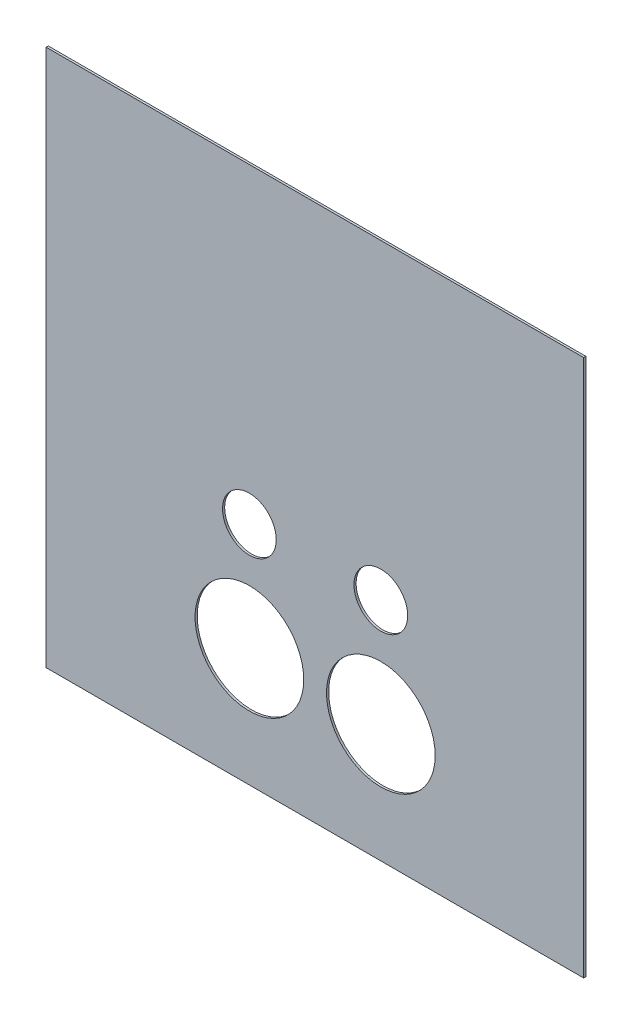
ISO-10303-21;
HEADER;
FILE_DESCRIPTION(('STEP AP214'),'2;1');
FILE_NAME('part.step','',(''),(''),'','','');
FILE_SCHEMA(('AUTOMOTIVE_DESIGN { 1 0 10303 214 1 1 1 1 }'));
ENDSEC;
DATA;
#1=APPLICATION_CONTEXT('core data for automotive mechanical design processes');
#2=APPLICATION_PROTOCOL_DEFINITION('international standard','automotive_design',2000,#1);
#3=PRODUCT_CONTEXT('',#1,'mechanical');
#4=PRODUCT('Part','Part','',(#3));
#5=PRODUCT_RELATED_PRODUCT_CATEGORY('part','',(#4));
#6=PRODUCT_DEFINITION_FORMATION('','',#4);
#7=PRODUCT_DEFINITION_CONTEXT('part definition',#1,'design');
#8=PRODUCT_DEFINITION('design','',#6,#7);
#9=PRODUCT_DEFINITION_SHAPE('','',#8);
#10=(LENGTH_UNIT() NAMED_UNIT(*) SI_UNIT(.MILLI.,.METRE.));
#11=(NAMED_UNIT(*) PLANE_ANGLE_UNIT() SI_UNIT($,.RADIAN.));
#12=(NAMED_UNIT(*) SI_UNIT($,.STERADIAN.) SOLID_ANGLE_UNIT());
#13=UNCERTAINTY_MEASURE_WITH_UNIT(LENGTH_MEASURE(1.E-05),#10,'distance_accuracy_value','');
#14=(GEOMETRIC_REPRESENTATION_CONTEXT(3) GLOBAL_UNCERTAINTY_ASSIGNED_CONTEXT((#13)) GLOBAL_UNIT_ASSIGNED_CONTEXT((#10,
#11,#12)) REPRESENTATION_CONTEXT('',''));
#15=CARTESIAN_POINT('',(0.,0.,0.));
#16=DIRECTION('',(0.,0.,1.));
#17=DIRECTION('',(1.,0.,0.));
#18=AXIS2_PLACEMENT_3D('',#15,#16,#17);
#19=CARTESIAN_POINT('',(-130.1775147929,329.881656804734,2.));
#20=DIRECTION('',(0.,1.,0.));
#21=DIRECTION('',(0.,0.,1.));
#22=AXIS2_PLACEMENT_3D('',#19,#20,#21);
#23=PLANE('',#22);
#24=DIRECTION('',(1.,0.,0.));
#25=VECTOR('',#24,1.);
#26=CARTESIAN_POINT('',(-130.1775147929,329.881656804734,0.));
#27=LINE('',#26,#25);
#28=CARTESIAN_POINT('',(-130.1775147929,329.881656804734,0.));
#29=VERTEX_POINT('',#28);
#30=CARTESIAN_POINT('',(369.8224852071,329.881656804734,0.));
#31=VERTEX_POINT('',#30);
#32=EDGE_CURVE('E101',#29,#31,#27,.T.);
#33=ORIENTED_EDGE('',*,*,#32,.F.);
#34=DIRECTION('',(0.,0.,-1.));
#35=VECTOR('',#34,1.);
#36=CARTESIAN_POINT('',(-130.1775147929,329.881656804734,2.));
#37=LINE('',#36,#35);
#38=CARTESIAN_POINT('',(-130.1775147929,329.881656804734,2.));
#39=VERTEX_POINT('',#38);
#40=EDGE_CURVE('E11',#39,#29,#37,.T.);
#41=ORIENTED_EDGE('',*,*,#40,.F.);
#42=DIRECTION('',(1.,0.,0.));
#43=VECTOR('',#42,1.);
#44=CARTESIAN_POINT('',(-130.1775147929,329.881656804734,2.));
#45=LINE('',#44,#43);
#46=CARTESIAN_POINT('',(369.8224852071,329.881656804734,2.));
#47=VERTEX_POINT('',#46);
#48=EDGE_CURVE('E95',#39,#47,#45,.T.);
#49=ORIENTED_EDGE('',*,*,#48,.T.);
#50=DIRECTION('',(0.,0.,-1.));
#51=VECTOR('',#50,1.);
#52=CARTESIAN_POINT('',(369.8224852071,329.881656804734,2.));
#53=LINE('',#52,#51);
#54=EDGE_CURVE('E74',#47,#31,#53,.T.);
#55=ORIENTED_EDGE('',*,*,#54,.T.);
#56=EDGE_LOOP('',(#33,#41,#49,#55));
#57=FACE_BOUND('',#56,.T.);
#58=ADVANCED_FACE('F33',(#57),#23,.T.);
#59=CARTESIAN_POINT('',(-130.1775147929,329.881656804734,2.));
#60=DIRECTION('',(1.,0.,0.));
#61=DIRECTION('',(0.,1.,0.));
#62=AXIS2_PLACEMENT_3D('',#59,#60,#61);
#63=PLANE('',#62);
#64=DIRECTION('',(0.,-1.,0.));
#65=VECTOR('',#64,1.);
#66=CARTESIAN_POINT('',(-130.1775147929,329.881656804734,0.));
#67=LINE('',#66,#65);
#68=CARTESIAN_POINT('',(-130.1775147929,-170.118343195266,0.));
#69=VERTEX_POINT('',#68);
#70=EDGE_CURVE('E66',#29,#69,#67,.T.);
#71=ORIENTED_EDGE('',*,*,#70,.T.);
#72=DIRECTION('',(0.,0.,-1.));
#73=VECTOR('',#72,1.);
#74=CARTESIAN_POINT('',(-130.1775147929,-170.118343195266,2.));
#75=LINE('',#74,#73);
#76=CARTESIAN_POINT('',(-130.1775147929,-170.118343195266,2.));
#77=VERTEX_POINT('',#76);
#78=EDGE_CURVE('E42',#77,#69,#75,.T.);
#79=ORIENTED_EDGE('',*,*,#78,.F.);
#80=DIRECTION('',(0.,-1.,0.));
#81=VECTOR('',#80,1.);
#82=CARTESIAN_POINT('',(-130.1775147929,329.881656804734,2.));
#83=LINE('',#82,#81);
#84=EDGE_CURVE('E84',#39,#77,#83,.T.);
#85=ORIENTED_EDGE('',*,*,#84,.F.);
#86=ORIENTED_EDGE('',*,*,#40,.T.);
#87=EDGE_LOOP('',(#71,#79,#85,#86));
#88=FACE_BOUND('',#87,.T.);
#89=ADVANCED_FACE('F151',(#88),#63,.F.);
#90=CARTESIAN_POINT('',(-130.1775147929,-170.118343195266,2.));
#91=DIRECTION('',(0.,1.,0.));
#92=DIRECTION('',(-1.,0.,0.));
#93=AXIS2_PLACEMENT_3D('',#90,#91,#92);
#94=PLANE('',#93);
#95=DIRECTION('',(1.,0.,0.));
#96=VECTOR('',#95,1.);
#97=CARTESIAN_POINT('',(-130.1775147929,-170.118343195266,0.));
#98=LINE('',#97,#96);
#99=CARTESIAN_POINT('',(369.8224852071,-170.118343195266,0.));
#100=VERTEX_POINT('',#99);
#101=EDGE_CURVE('E91',#69,#100,#98,.T.);
#102=ORIENTED_EDGE('',*,*,#101,.T.);
#103=DIRECTION('',(0.,0.,-1.));
#104=VECTOR('',#103,1.);
#105=CARTESIAN_POINT('',(369.8224852071,-170.118343195266,2.));
#106=LINE('',#105,#104);
#107=CARTESIAN_POINT('',(369.8224852071,-170.118343195266,2.));
#108=VERTEX_POINT('',#107);
#109=EDGE_CURVE('E88',#108,#100,#106,.T.);
#110=ORIENTED_EDGE('',*,*,#109,.F.);
#111=DIRECTION('',(1.,0.,0.));
#112=VECTOR('',#111,1.);
#113=CARTESIAN_POINT('',(-130.1775147929,-170.118343195266,2.));
#114=LINE('',#113,#112);
#115=EDGE_CURVE('E79',#77,#108,#114,.T.);
#116=ORIENTED_EDGE('',*,*,#115,.F.);
#117=ORIENTED_EDGE('',*,*,#78,.T.);
#118=EDGE_LOOP('',(#102,#110,#116,#117));
#119=FACE_BOUND('',#118,.T.);
#120=ADVANCED_FACE('F89',(#119),#94,.F.);
#121=CARTESIAN_POINT('',(369.8224852071,329.881656804734,2.));
#122=DIRECTION('',(1.,0.,0.));
#123=DIRECTION('',(0.,0.,-1.));
#124=AXIS2_PLACEMENT_3D('',#121,#122,#123);
#125=PLANE('',#124);
#126=DIRECTION('',(0.,-1.,0.));
#127=VECTOR('',#126,1.);
#128=CARTESIAN_POINT('',(369.8224852071,329.881656804734,0.));
#129=LINE('',#128,#127);
#130=EDGE_CURVE('E104',#31,#100,#129,.T.);
#131=ORIENTED_EDGE('',*,*,#130,.F.);
#132=ORIENTED_EDGE('',*,*,#54,.F.);
#133=DIRECTION('',(0.,-1.,0.));
#134=VECTOR('',#133,1.);
#135=CARTESIAN_POINT('',(369.8224852071,329.881656804734,2.));
#136=LINE('',#135,#134);
#137=EDGE_CURVE('E83',#47,#108,#136,.T.);
#138=ORIENTED_EDGE('',*,*,#137,.T.);
#139=ORIENTED_EDGE('',*,*,#109,.T.);
#140=EDGE_LOOP('',(#131,#132,#138,#139));
#141=FACE_BOUND('',#140,.T.);
#142=ADVANCED_FACE('F94',(#141),#125,.T.);
#143=CARTESIAN_POINT('',(0.,0.,2.));
#144=DIRECTION('',(0.,0.,-1.));
#145=DIRECTION('',(-1.,0.,0.));
#146=AXIS2_PLACEMENT_3D('',#143,#144,#145);
#147=PLANE('',#146);
#148=CARTESIAN_POINT('',(181.1424852071,40.0316568047339,2.));
#149=DIRECTION('',(0.,0.,1.));
#150=DIRECTION('',(1.,0.,0.));
#151=AXIS2_PLACEMENT_3D('',#148,#149,#150);
#152=CIRCLE('',#151,25.);
#153=CARTESIAN_POINT('',(206.1424852071,40.0316568047339,2.));
#154=VERTEX_POINT('',#153);
#155=EDGE_CURVE('E112',#154,#154,#152,.T.);
#156=ORIENTED_EDGE('',*,*,#155,.F.);
#157=EDGE_LOOP('',(#156));
#158=FACE_BOUND('',#157,.T.);
#159=CARTESIAN_POINT('',(58.8424852071004,40.0316568047339,2.));
#160=DIRECTION('',(0.,0.,1.));
#161=DIRECTION('',(1.,0.,0.));
#162=AXIS2_PLACEMENT_3D('',#159,#160,#161);
#163=CIRCLE('',#162,25.);
#164=CARTESIAN_POINT('',(83.8424852071004,40.0316568047339,2.));
#165=VERTEX_POINT('',#164);
#166=EDGE_CURVE('E118',#165,#165,#163,.T.);
#167=ORIENTED_EDGE('',*,*,#166,.F.);
#168=EDGE_LOOP('',(#167));
#169=FACE_BOUND('',#168,.T.);
#170=CARTESIAN_POINT('',(58.8424852071004,-59.9683431952661,2.));
#171=DIRECTION('',(0.,0.,1.));
#172=DIRECTION('',(1.,0.,0.));
#173=AXIS2_PLACEMENT_3D('',#170,#171,#172);
#174=CIRCLE('',#173,50.55);
#175=CARTESIAN_POINT('',(109.3924852071,-59.9683431952661,2.));
#176=VERTEX_POINT('',#175);
#177=EDGE_CURVE('E127',#176,#176,#174,.T.);
#178=ORIENTED_EDGE('',*,*,#177,.F.);
#179=EDGE_LOOP('',(#178));
#180=FACE_BOUND('',#179,.T.);
#181=CARTESIAN_POINT('',(181.1424852071,-59.9683431952661,2.));
#182=DIRECTION('',(0.,0.,1.));
#183=DIRECTION('',(1.,0.,0.));
#184=AXIS2_PLACEMENT_3D('',#181,#182,#183);
#185=CIRCLE('',#184,50.55);
#186=CARTESIAN_POINT('',(231.6924852071,-59.9683431952661,2.));
#187=VERTEX_POINT('',#186);
#188=EDGE_CURVE('E116',#187,#187,#185,.T.);
#189=ORIENTED_EDGE('',*,*,#188,.F.);
#190=EDGE_LOOP('',(#189));
#191=FACE_BOUND('',#190,.T.);
#192=ORIENTED_EDGE('',*,*,#48,.F.);
#193=ORIENTED_EDGE('',*,*,#84,.T.);
#194=ORIENTED_EDGE('',*,*,#115,.T.);
#195=ORIENTED_EDGE('',*,*,#137,.F.);
#196=EDGE_LOOP('',(#192,#193,#194,#195));
#197=FACE_BOUND('',#196,.T.);
#198=ADVANCED_FACE('F82',(#158,#169,#180,#191,#197),#147,.F.);
#199=CARTESIAN_POINT('',(0.,0.,0.));
#200=DIRECTION('',(0.,0.,-1.));
#201=DIRECTION('',(-1.,0.,0.));
#202=AXIS2_PLACEMENT_3D('',#199,#200,#201);
#203=PLANE('',#202);
#204=CARTESIAN_POINT('',(181.1424852071,40.0316568047339,0.));
#205=DIRECTION('',(0.,0.,-1.));
#206=DIRECTION('',(-1.,0.,0.));
#207=AXIS2_PLACEMENT_3D('',#204,#205,#206);
#208=CIRCLE('',#207,25.);
#209=CARTESIAN_POINT('',(156.1424852071,40.0316568047339,0.));
#210=VERTEX_POINT('',#209);
#211=EDGE_CURVE('E36',#210,#210,#208,.T.);
#212=ORIENTED_EDGE('',*,*,#211,.F.);
#213=EDGE_LOOP('',(#212));
#214=FACE_BOUND('',#213,.T.);
#215=CARTESIAN_POINT('',(58.8424852071004,40.0316568047339,0.));
#216=DIRECTION('',(0.,0.,-1.));
#217=DIRECTION('',(-1.,0.,0.));
#218=AXIS2_PLACEMENT_3D('',#215,#216,#217);
#219=CIRCLE('',#218,25.);
#220=CARTESIAN_POINT('',(33.8424852071004,40.0316568047339,0.));
#221=VERTEX_POINT('',#220);
#222=EDGE_CURVE('E110',#221,#221,#219,.T.);
#223=ORIENTED_EDGE('',*,*,#222,.F.);
#224=EDGE_LOOP('',(#223));
#225=FACE_BOUND('',#224,.T.);
#226=CARTESIAN_POINT('',(58.8424852071004,-59.9683431952661,0.));
#227=DIRECTION('',(0.,0.,1.));
#228=DIRECTION('',(1.,0.,0.));
#229=AXIS2_PLACEMENT_3D('',#226,#227,#228);
#230=CIRCLE('',#229,50.55);
#231=CARTESIAN_POINT('',(109.3924852071,-59.9683431952661,0.));
#232=VERTEX_POINT('',#231);
#233=EDGE_CURVE('E105',#232,#232,#230,.T.);
#234=ORIENTED_EDGE('',*,*,#233,.T.);
#235=EDGE_LOOP('',(#234));
#236=FACE_BOUND('',#235,.T.);
#237=CARTESIAN_POINT('',(181.1424852071,-59.9683431952661,0.));
#238=DIRECTION('',(0.,0.,1.));
#239=DIRECTION('',(1.,0.,0.));
#240=AXIS2_PLACEMENT_3D('',#237,#238,#239);
#241=CIRCLE('',#240,50.55);
#242=CARTESIAN_POINT('',(231.6924852071,-59.9683431952661,0.));
#243=VERTEX_POINT('',#242);
#244=EDGE_CURVE('E130',#243,#243,#241,.T.);
#245=ORIENTED_EDGE('',*,*,#244,.T.);
#246=EDGE_LOOP('',(#245));
#247=FACE_BOUND('',#246,.T.);
#248=ORIENTED_EDGE('',*,*,#32,.T.);
#249=ORIENTED_EDGE('',*,*,#130,.T.);
#250=ORIENTED_EDGE('',*,*,#101,.F.);
#251=ORIENTED_EDGE('',*,*,#70,.F.);
#252=EDGE_LOOP('',(#248,#249,#250,#251));
#253=FACE_BOUND('',#252,.T.);
#254=ADVANCED_FACE('F138',(#214,#225,#236,#247,#253),#203,.T.);
#255=CARTESIAN_POINT('',(181.1424852071,-59.9683431952661,0.));
#256=DIRECTION('',(0.,0.,1.));
#257=DIRECTION('',(1.,0.,0.));
#258=AXIS2_PLACEMENT_3D('',#255,#256,#257);
#259=CYLINDRICAL_SURFACE('',#258,50.55);
#260=ORIENTED_EDGE('',*,*,#244,.F.);
#261=EDGE_LOOP('',(#260));
#262=FACE_BOUND('',#261,.T.);
#263=ORIENTED_EDGE('',*,*,#188,.T.);
#264=EDGE_LOOP('',(#263));
#265=FACE_BOUND('',#264,.T.);
#266=ADVANCED_FACE('F135',(#262,#265),#259,.F.);
#267=CARTESIAN_POINT('',(58.8424852071004,-59.9683431952661,0.));
#268=DIRECTION('',(0.,0.,1.));
#269=DIRECTION('',(1.,0.,0.));
#270=AXIS2_PLACEMENT_3D('',#267,#268,#269);
#271=CYLINDRICAL_SURFACE('',#270,50.55);
#272=ORIENTED_EDGE('',*,*,#233,.F.);
#273=EDGE_LOOP('',(#272));
#274=FACE_BOUND('',#273,.T.);
#275=ORIENTED_EDGE('',*,*,#177,.T.);
#276=EDGE_LOOP('',(#275));
#277=FACE_BOUND('',#276,.T.);
#278=ADVANCED_FACE('F185',(#274,#277),#271,.F.);
#279=CARTESIAN_POINT('',(58.8424852071004,40.0316568047339,-8.));
#280=DIRECTION('',(0.,0.,1.));
#281=DIRECTION('',(1.,0.,0.));
#282=AXIS2_PLACEMENT_3D('',#279,#280,#281);
#283=CYLINDRICAL_SURFACE('',#282,25.);
#284=ORIENTED_EDGE('',*,*,#222,.T.);
#285=EDGE_LOOP('',(#284));
#286=FACE_BOUND('',#285,.T.);
#287=ORIENTED_EDGE('',*,*,#166,.T.);
#288=EDGE_LOOP('',(#287));
#289=FACE_BOUND('',#288,.T.);
#290=ADVANCED_FACE('F190',(#286,#289),#283,.F.);
#291=CARTESIAN_POINT('',(181.1424852071,40.0316568047339,-8.));
#292=DIRECTION('',(0.,0.,1.));
#293=DIRECTION('',(1.,0.,0.));
#294=AXIS2_PLACEMENT_3D('',#291,#292,#293);
#295=CYLINDRICAL_SURFACE('',#294,25.);
#296=ORIENTED_EDGE('',*,*,#211,.T.);
#297=EDGE_LOOP('',(#296));
#298=FACE_BOUND('',#297,.T.);
#299=ORIENTED_EDGE('',*,*,#155,.T.);
#300=EDGE_LOOP('',(#299));
#301=FACE_BOUND('',#300,.T.);
#302=ADVANCED_FACE('F197',(#298,#301),#295,.F.);
#303=CLOSED_SHELL('',(#58,#89,#120,#142,#198,#254,#266,#278,#290,#302));
#304=MANIFOLD_SOLID_BREP('B2',#303);
#305=ADVANCED_BREP_SHAPE_REPRESENTATION('',(#18,#304),#14);
#306=SHAPE_DEFINITION_REPRESENTATION(#9,#305);
ENDSEC;
END-ISO-10303-21;
